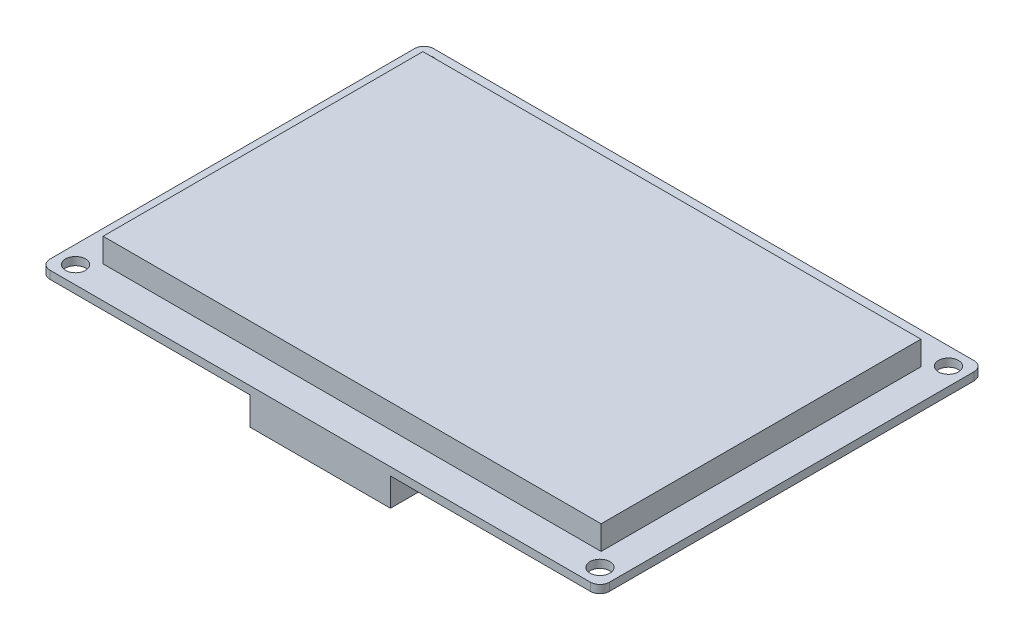
ISO-10303-21;
HEADER;
FILE_DESCRIPTION(('STEP AP214'),'2;1');
FILE_NAME('part.step','',(''),(''),'','','');
FILE_SCHEMA(('AUTOMOTIVE_DESIGN { 1 0 10303 214 1 1 1 1 }'));
ENDSEC;
DATA;
#1=APPLICATION_CONTEXT('core data for automotive mechanical design processes');
#2=APPLICATION_PROTOCOL_DEFINITION('international standard','automotive_design',2000,#1);
#3=PRODUCT_CONTEXT('',#1,'mechanical');
#4=PRODUCT('Part','Part','',(#3));
#5=PRODUCT_RELATED_PRODUCT_CATEGORY('part','',(#4));
#6=PRODUCT_DEFINITION_FORMATION('','',#4);
#7=PRODUCT_DEFINITION_CONTEXT('part definition',#1,'design');
#8=PRODUCT_DEFINITION('design','',#6,#7);
#9=PRODUCT_DEFINITION_SHAPE('','',#8);
#10=(LENGTH_UNIT() NAMED_UNIT(*) SI_UNIT(.MILLI.,.METRE.));
#11=(NAMED_UNIT(*) PLANE_ANGLE_UNIT() SI_UNIT($,.RADIAN.));
#12=(NAMED_UNIT(*) SI_UNIT($,.STERADIAN.) SOLID_ANGLE_UNIT());
#13=UNCERTAINTY_MEASURE_WITH_UNIT(LENGTH_MEASURE(1.E-05),#10,'distance_accuracy_value','');
#14=(GEOMETRIC_REPRESENTATION_CONTEXT(3) GLOBAL_UNCERTAINTY_ASSIGNED_CONTEXT((#13)) GLOBAL_UNIT_ASSIGNED_CONTEXT((#10,
#11,#12)) REPRESENTATION_CONTEXT('',''));
#15=CARTESIAN_POINT('',(0.,0.,0.));
#16=DIRECTION('',(0.,0.,1.));
#17=DIRECTION('',(1.,0.,0.));
#18=AXIS2_PLACEMENT_3D('',#15,#16,#17);
#19=CARTESIAN_POINT('',(0.,1.,0.));
#20=DIRECTION('',(0.,-1.,0.));
#21=DIRECTION('',(0.,0.,-1.));
#22=AXIS2_PLACEMENT_3D('',#19,#20,#21);
#23=PLANE('',#22);
#24=CARTESIAN_POINT('',(32.8,1.,-21.8));
#25=DIRECTION('',(0.,1.,0.));
#26=DIRECTION('',(0.,0.,-1.));
#27=AXIS2_PLACEMENT_3D('',#24,#25,#26);
#28=CIRCLE('',#27,1.25);
#29=CARTESIAN_POINT('',(32.8,1.,-23.05));
#30=VERTEX_POINT('',#29);
#31=EDGE_CURVE('E218',#30,#30,#28,.T.);
#32=ORIENTED_EDGE('',*,*,#31,.F.);
#33=EDGE_LOOP('',(#32));
#34=FACE_BOUND('',#33,.T.);
#35=CARTESIAN_POINT('',(32.8,1.,21.8));
#36=DIRECTION('',(0.,1.,0.));
#37=DIRECTION('',(0.,0.,1.));
#38=AXIS2_PLACEMENT_3D('',#35,#36,#37);
#39=CIRCLE('',#38,1.25);
#40=CARTESIAN_POINT('',(32.8,1.,23.05));
#41=VERTEX_POINT('',#40);
#42=EDGE_CURVE('E224',#41,#41,#39,.T.);
#43=ORIENTED_EDGE('',*,*,#42,.F.);
#44=EDGE_LOOP('',(#43));
#45=FACE_BOUND('',#44,.T.);
#46=CARTESIAN_POINT('',(-32.8,1.,21.8));
#47=DIRECTION('',(0.,1.,0.));
#48=DIRECTION('',(0.,0.,-1.));
#49=AXIS2_PLACEMENT_3D('',#46,#47,#48);
#50=CIRCLE('',#49,1.25);
#51=CARTESIAN_POINT('',(-32.8,1.,20.55));
#52=VERTEX_POINT('',#51);
#53=EDGE_CURVE('E230',#52,#52,#50,.T.);
#54=ORIENTED_EDGE('',*,*,#53,.F.);
#55=EDGE_LOOP('',(#54));
#56=FACE_BOUND('',#55,.T.);
#57=CARTESIAN_POINT('',(-32.8,1.,-21.8));
#58=DIRECTION('',(0.,1.,0.));
#59=DIRECTION('',(0.,0.,1.));
#60=AXIS2_PLACEMENT_3D('',#57,#58,#59);
#61=CIRCLE('',#60,1.25);
#62=CARTESIAN_POINT('',(-32.8,1.,-20.55));
#63=VERTEX_POINT('',#62);
#64=EDGE_CURVE('E236',#63,#63,#61,.T.);
#65=ORIENTED_EDGE('',*,*,#64,.F.);
#66=EDGE_LOOP('',(#65));
#67=FACE_BOUND('',#66,.T.);
#68=DIRECTION('',(0.,0.,1.));
#69=VECTOR('',#68,1.);
#70=CARTESIAN_POINT('',(-35.,1.,24.));
#71=LINE('',#70,#69);
#72=CARTESIAN_POINT('',(-35.,1.,-22.8));
#73=VERTEX_POINT('',#72);
#74=CARTESIAN_POINT('',(-35.,1.,22.8));
#75=VERTEX_POINT('',#74);
#76=EDGE_CURVE('E247',#73,#75,#71,.T.);
#77=ORIENTED_EDGE('',*,*,#76,.T.);
#78=CARTESIAN_POINT('',(-33.8,1.,22.8));
#79=DIRECTION('',(0.,-1.,0.));
#80=DIRECTION('',(0.,0.,-1.));
#81=AXIS2_PLACEMENT_3D('',#78,#79,#80);
#82=CIRCLE('',#81,1.2);
#83=CARTESIAN_POINT('',(-33.8,1.,24.));
#84=VERTEX_POINT('',#83);
#85=EDGE_CURVE('E285',#75,#84,#82,.F.);
#86=ORIENTED_EDGE('',*,*,#85,.T.);
#87=DIRECTION('',(1.,0.,0.));
#88=VECTOR('',#87,1.);
#89=CARTESIAN_POINT('',(-35.,1.,24.));
#90=LINE('',#89,#88);
#91=CARTESIAN_POINT('',(33.8,1.,24.));
#92=VERTEX_POINT('',#91);
#93=EDGE_CURVE('E250',#84,#92,#90,.T.);
#94=ORIENTED_EDGE('',*,*,#93,.T.);
#95=CARTESIAN_POINT('',(33.8,1.,22.8));
#96=DIRECTION('',(0.,-1.,0.));
#97=DIRECTION('',(0.,0.,-1.));
#98=AXIS2_PLACEMENT_3D('',#95,#96,#97);
#99=CIRCLE('',#98,1.2);
#100=CARTESIAN_POINT('',(35.,1.,22.8));
#101=VERTEX_POINT('',#100);
#102=EDGE_CURVE('E280',#92,#101,#99,.F.);
#103=ORIENTED_EDGE('',*,*,#102,.T.);
#104=DIRECTION('',(0.,0.,-1.));
#105=VECTOR('',#104,1.);
#106=CARTESIAN_POINT('',(35.,1.,24.));
#107=LINE('',#106,#105);
#108=CARTESIAN_POINT('',(35.,1.,-22.8));
#109=VERTEX_POINT('',#108);
#110=EDGE_CURVE('E242',#101,#109,#107,.T.);
#111=ORIENTED_EDGE('',*,*,#110,.T.);
#112=CARTESIAN_POINT('',(33.8,1.,-22.8));
#113=DIRECTION('',(0.,-1.,0.));
#114=DIRECTION('',(0.,0.,-1.));
#115=AXIS2_PLACEMENT_3D('',#112,#113,#114);
#116=CIRCLE('',#115,1.2);
#117=CARTESIAN_POINT('',(33.8,1.,-24.));
#118=VERTEX_POINT('',#117);
#119=EDGE_CURVE('E61',#109,#118,#116,.F.);
#120=ORIENTED_EDGE('',*,*,#119,.T.);
#121=DIRECTION('',(-1.,0.,0.));
#122=VECTOR('',#121,1.);
#123=CARTESIAN_POINT('',(-35.,1.,-24.));
#124=LINE('',#123,#122);
#125=CARTESIAN_POINT('',(-33.8,1.,-24.));
#126=VERTEX_POINT('',#125);
#127=EDGE_CURVE('E244',#118,#126,#124,.T.);
#128=ORIENTED_EDGE('',*,*,#127,.T.);
#129=CARTESIAN_POINT('',(-33.8,1.,-22.8));
#130=DIRECTION('',(0.,-1.,0.));
#131=DIRECTION('',(0.,0.,-1.));
#132=AXIS2_PLACEMENT_3D('',#129,#130,#131);
#133=CIRCLE('',#132,1.2);
#134=EDGE_CURVE('E283',#126,#73,#133,.F.);
#135=ORIENTED_EDGE('',*,*,#134,.T.);
#136=EDGE_LOOP('',(#77,#86,#94,#103,#111,#120,#128,#135));
#137=FACE_BOUND('',#136,.T.);
#138=DIRECTION('',(0.,0.,-1.));
#139=VECTOR('',#138,1.);
#140=CARTESIAN_POINT('',(31.15,1.,20.));
#141=LINE('',#140,#139);
#142=CARTESIAN_POINT('',(31.15,1.,20.));
#143=VERTEX_POINT('',#142);
#144=CARTESIAN_POINT('',(31.15,1.,-20.));
#145=VERTEX_POINT('',#144);
#146=EDGE_CURVE('E179',#143,#145,#141,.T.);
#147=ORIENTED_EDGE('',*,*,#146,.F.);
#148=DIRECTION('',(1.,0.,0.));
#149=VECTOR('',#148,1.);
#150=CARTESIAN_POINT('',(-31.15,1.,20.));
#151=LINE('',#150,#149);
#152=CARTESIAN_POINT('',(-31.15,1.,20.));
#153=VERTEX_POINT('',#152);
#154=EDGE_CURVE('E192',#153,#143,#151,.T.);
#155=ORIENTED_EDGE('',*,*,#154,.F.);
#156=DIRECTION('',(0.,0.,1.));
#157=VECTOR('',#156,1.);
#158=CARTESIAN_POINT('',(-31.15,1.,20.));
#159=LINE('',#158,#157);
#160=CARTESIAN_POINT('',(-31.15,1.,-20.));
#161=VERTEX_POINT('',#160);
#162=EDGE_CURVE('E201',#161,#153,#159,.T.);
#163=ORIENTED_EDGE('',*,*,#162,.F.);
#164=DIRECTION('',(-1.,0.,0.));
#165=VECTOR('',#164,1.);
#166=CARTESIAN_POINT('',(-31.15,1.,-20.));
#167=LINE('',#166,#165);
#168=EDGE_CURVE('E182',#145,#161,#167,.T.);
#169=ORIENTED_EDGE('',*,*,#168,.F.);
#170=EDGE_LOOP('',(#147,#155,#163,#169));
#171=FACE_BOUND('',#170,.T.);
#172=ADVANCED_FACE('F39',(#34,#45,#56,#67,#137,#171),#23,.F.);
#173=CARTESIAN_POINT('',(0.,0.,0.));
#174=DIRECTION('',(0.,-1.,0.));
#175=DIRECTION('',(0.,0.,-1.));
#176=AXIS2_PLACEMENT_3D('',#173,#174,#175);
#177=PLANE('',#176);
#178=DIRECTION('',(1.,0.,0.));
#179=VECTOR('',#178,1.);
#180=CARTESIAN_POINT('',(-35.,0.,24.));
#181=LINE('',#180,#179);
#182=CARTESIAN_POINT('',(-33.8,0.,24.));
#183=VERTEX_POINT('',#182);
#184=CARTESIAN_POINT('',(-8.80000000000001,0.,24.));
#185=VERTEX_POINT('',#184);
#186=EDGE_CURVE('E245',#183,#185,#181,.T.);
#187=ORIENTED_EDGE('',*,*,#186,.F.);
#188=CARTESIAN_POINT('',(-33.8,0.,22.8));
#189=DIRECTION('',(0.,-1.,0.));
#190=DIRECTION('',(0.,0.,-1.));
#191=AXIS2_PLACEMENT_3D('',#188,#189,#190);
#192=CIRCLE('',#191,1.2);
#193=CARTESIAN_POINT('',(-35.,0.,22.8));
#194=VERTEX_POINT('',#193);
#195=EDGE_CURVE('E273',#183,#194,#192,.T.);
#196=ORIENTED_EDGE('',*,*,#195,.T.);
#197=DIRECTION('',(0.,0.,1.));
#198=VECTOR('',#197,1.);
#199=CARTESIAN_POINT('',(-35.,0.,24.));
#200=LINE('',#199,#198);
#201=CARTESIAN_POINT('',(-35.,0.,-22.8));
#202=VERTEX_POINT('',#201);
#203=EDGE_CURVE('E258',#202,#194,#200,.T.);
#204=ORIENTED_EDGE('',*,*,#203,.F.);
#205=CARTESIAN_POINT('',(-33.8,0.,-22.8));
#206=DIRECTION('',(0.,-1.,0.));
#207=DIRECTION('',(0.,0.,-1.));
#208=AXIS2_PLACEMENT_3D('',#205,#206,#207);
#209=CIRCLE('',#208,1.2);
#210=CARTESIAN_POINT('',(-33.8,0.,-24.));
#211=VERTEX_POINT('',#210);
#212=EDGE_CURVE('E271',#202,#211,#209,.T.);
#213=ORIENTED_EDGE('',*,*,#212,.T.);
#214=DIRECTION('',(-1.,0.,0.));
#215=VECTOR('',#214,1.);
#216=CARTESIAN_POINT('',(-35.,0.,-24.));
#217=LINE('',#216,#215);
#218=CARTESIAN_POINT('',(33.8,0.,-24.));
#219=VERTEX_POINT('',#218);
#220=EDGE_CURVE('E256',#219,#211,#217,.T.);
#221=ORIENTED_EDGE('',*,*,#220,.F.);
#222=CARTESIAN_POINT('',(33.8,0.,-22.8));
#223=DIRECTION('',(0.,-1.,0.));
#224=DIRECTION('',(0.,0.,-1.));
#225=AXIS2_PLACEMENT_3D('',#222,#223,#224);
#226=CIRCLE('',#225,1.2);
#227=CARTESIAN_POINT('',(35.,0.,-22.8));
#228=VERTEX_POINT('',#227);
#229=EDGE_CURVE('E269',#219,#228,#226,.T.);
#230=ORIENTED_EDGE('',*,*,#229,.T.);
#231=DIRECTION('',(0.,0.,-1.));
#232=VECTOR('',#231,1.);
#233=CARTESIAN_POINT('',(35.,0.,24.));
#234=LINE('',#233,#232);
#235=CARTESIAN_POINT('',(35.,0.,22.8));
#236=VERTEX_POINT('',#235);
#237=EDGE_CURVE('E239',#236,#228,#234,.T.);
#238=ORIENTED_EDGE('',*,*,#237,.F.);
#239=CARTESIAN_POINT('',(33.8,0.,22.8));
#240=DIRECTION('',(0.,-1.,0.));
#241=DIRECTION('',(0.,0.,-1.));
#242=AXIS2_PLACEMENT_3D('',#239,#240,#241);
#243=CIRCLE('',#242,1.2);
#244=CARTESIAN_POINT('',(33.8,0.,24.));
#245=VERTEX_POINT('',#244);
#246=EDGE_CURVE('E267',#236,#245,#243,.T.);
#247=ORIENTED_EDGE('',*,*,#246,.T.);
#248=CARTESIAN_POINT('',(8.8,0.,24.));
#249=VERTEX_POINT('',#248);
#250=EDGE_CURVE('E261',#249,#245,#181,.T.);
#251=ORIENTED_EDGE('',*,*,#250,.F.);
#252=DIRECTION('',(0.,0.,1.));
#253=VECTOR('',#252,1.);
#254=CARTESIAN_POINT('',(8.8,0.,-7.));
#255=LINE('',#254,#253);
#256=CARTESIAN_POINT('',(8.8,0.,-7.));
#257=VERTEX_POINT('',#256);
#258=EDGE_CURVE('E178',#257,#249,#255,.T.);
#259=ORIENTED_EDGE('',*,*,#258,.F.);
#260=DIRECTION('',(1.,0.,0.));
#261=VECTOR('',#260,1.);
#262=CARTESIAN_POINT('',(-8.8,0.,-7.));
#263=LINE('',#262,#261);
#264=CARTESIAN_POINT('',(-8.8,0.,-7.));
#265=VERTEX_POINT('',#264);
#266=EDGE_CURVE('E175',#265,#257,#263,.T.);
#267=ORIENTED_EDGE('',*,*,#266,.F.);
#268=DIRECTION('',(0.,0.,-1.));
#269=VECTOR('',#268,1.);
#270=CARTESIAN_POINT('',(-8.8,0.,-7.));
#271=LINE('',#270,#269);
#272=EDGE_CURVE('E559',#185,#265,#271,.T.);
#273=ORIENTED_EDGE('',*,*,#272,.F.);
#274=EDGE_LOOP('',(#187,#196,#204,#213,#221,#230,#238,#247,#251,#259,#267,#273));
#275=FACE_BOUND('',#274,.T.);
#276=CARTESIAN_POINT('',(32.8,0.,21.8));
#277=DIRECTION('',(0.,1.,0.));
#278=DIRECTION('',(0.,0.,1.));
#279=AXIS2_PLACEMENT_3D('',#276,#277,#278);
#280=CIRCLE('',#279,1.25);
#281=CARTESIAN_POINT('',(32.8,0.,23.05));
#282=VERTEX_POINT('',#281);
#283=EDGE_CURVE('E221',#282,#282,#280,.T.);
#284=ORIENTED_EDGE('',*,*,#283,.T.);
#285=EDGE_LOOP('',(#284));
#286=FACE_BOUND('',#285,.T.);
#287=CARTESIAN_POINT('',(-32.8,0.,-21.8));
#288=DIRECTION('',(0.,1.,0.));
#289=DIRECTION('',(0.,0.,1.));
#290=AXIS2_PLACEMENT_3D('',#287,#288,#289);
#291=CIRCLE('',#290,1.25);
#292=CARTESIAN_POINT('',(-32.8,0.,-20.55));
#293=VERTEX_POINT('',#292);
#294=EDGE_CURVE('E233',#293,#293,#291,.T.);
#295=ORIENTED_EDGE('',*,*,#294,.T.);
#296=EDGE_LOOP('',(#295));
#297=FACE_BOUND('',#296,.T.);
#298=CARTESIAN_POINT('',(-32.8,0.,21.8));
#299=DIRECTION('',(0.,1.,0.));
#300=DIRECTION('',(0.,0.,-1.));
#301=AXIS2_PLACEMENT_3D('',#298,#299,#300);
#302=CIRCLE('',#301,1.25);
#303=CARTESIAN_POINT('',(-32.8,0.,20.55));
#304=VERTEX_POINT('',#303);
#305=EDGE_CURVE('E227',#304,#304,#302,.T.);
#306=ORIENTED_EDGE('',*,*,#305,.T.);
#307=EDGE_LOOP('',(#306));
#308=FACE_BOUND('',#307,.T.);
#309=CARTESIAN_POINT('',(32.8,0.,-21.8));
#310=DIRECTION('',(0.,1.,0.));
#311=DIRECTION('',(0.,0.,-1.));
#312=AXIS2_PLACEMENT_3D('',#309,#310,#311);
#313=CIRCLE('',#312,1.25);
#314=CARTESIAN_POINT('',(32.8,0.,-23.05));
#315=VERTEX_POINT('',#314);
#316=EDGE_CURVE('E217',#315,#315,#313,.T.);
#317=ORIENTED_EDGE('',*,*,#316,.T.);
#318=EDGE_LOOP('',(#317));
#319=FACE_BOUND('',#318,.T.);
#320=ADVANCED_FACE('F301',(#275,#286,#297,#308,#319),#177,.T.);
#321=CARTESIAN_POINT('',(35.,1.,24.));
#322=DIRECTION('',(-1.,0.,0.));
#323=DIRECTION('',(0.,0.,1.));
#324=AXIS2_PLACEMENT_3D('',#321,#322,#323);
#325=PLANE('',#324);
#326=ORIENTED_EDGE('',*,*,#237,.T.);
#327=DIRECTION('',(0.,-1.,0.));
#328=VECTOR('',#327,1.);
#329=CARTESIAN_POINT('',(35.,1.,-22.8));
#330=LINE('',#329,#328);
#331=EDGE_CURVE('E11',#228,#109,#330,.F.);
#332=ORIENTED_EDGE('',*,*,#331,.T.);
#333=ORIENTED_EDGE('',*,*,#110,.F.);
#334=DIRECTION('',(0.,-1.,0.));
#335=VECTOR('',#334,1.);
#336=CARTESIAN_POINT('',(35.,1.,22.8));
#337=LINE('',#336,#335);
#338=EDGE_CURVE('E47',#101,#236,#337,.T.);
#339=ORIENTED_EDGE('',*,*,#338,.T.);
#340=EDGE_LOOP('',(#326,#332,#333,#339));
#341=FACE_BOUND('',#340,.T.);
#342=ADVANCED_FACE('F295',(#341),#325,.F.);
#343=CARTESIAN_POINT('',(-35.,1.,-24.));
#344=DIRECTION('',(0.,0.,1.));
#345=DIRECTION('',(1.,0.,0.));
#346=AXIS2_PLACEMENT_3D('',#343,#344,#345);
#347=PLANE('',#346);
#348=ORIENTED_EDGE('',*,*,#220,.T.);
#349=DIRECTION('',(0.,-1.,0.));
#350=VECTOR('',#349,1.);
#351=CARTESIAN_POINT('',(-33.8,1.,-24.));
#352=LINE('',#351,#350);
#353=EDGE_CURVE('E54',#211,#126,#352,.F.);
#354=ORIENTED_EDGE('',*,*,#353,.T.);
#355=ORIENTED_EDGE('',*,*,#127,.F.);
#356=DIRECTION('',(0.,-1.,0.));
#357=VECTOR('',#356,1.);
#358=CARTESIAN_POINT('',(33.8,1.,-24.));
#359=LINE('',#358,#357);
#360=EDGE_CURVE('E287',#118,#219,#359,.T.);
#361=ORIENTED_EDGE('',*,*,#360,.T.);
#362=EDGE_LOOP('',(#348,#354,#355,#361));
#363=FACE_BOUND('',#362,.T.);
#364=ADVANCED_FACE('F307',(#363),#347,.F.);
#365=CARTESIAN_POINT('',(-35.,1.,24.));
#366=DIRECTION('',(1.,0.,0.));
#367=DIRECTION('',(0.,0.,-1.));
#368=AXIS2_PLACEMENT_3D('',#365,#366,#367);
#369=PLANE('',#368);
#370=ORIENTED_EDGE('',*,*,#203,.T.);
#371=DIRECTION('',(0.,-1.,0.));
#372=VECTOR('',#371,1.);
#373=CARTESIAN_POINT('',(-35.,1.,22.8));
#374=LINE('',#373,#372);
#375=EDGE_CURVE('E278',#194,#75,#374,.F.);
#376=ORIENTED_EDGE('',*,*,#375,.T.);
#377=ORIENTED_EDGE('',*,*,#76,.F.);
#378=DIRECTION('',(0.,-1.,0.));
#379=VECTOR('',#378,1.);
#380=CARTESIAN_POINT('',(-35.,1.,-22.8));
#381=LINE('',#380,#379);
#382=EDGE_CURVE('E275',#73,#202,#381,.T.);
#383=ORIENTED_EDGE('',*,*,#382,.T.);
#384=EDGE_LOOP('',(#370,#376,#377,#383));
#385=FACE_BOUND('',#384,.T.);
#386=ADVANCED_FACE('F316',(#385),#369,.F.);
#387=CARTESIAN_POINT('',(-35.,1.,24.));
#388=DIRECTION('',(0.,0.,-1.));
#389=DIRECTION('',(-1.,0.,0.));
#390=AXIS2_PLACEMENT_3D('',#387,#388,#389);
#391=PLANE('',#390);
#392=ORIENTED_EDGE('',*,*,#93,.F.);
#393=DIRECTION('',(0.,-1.,0.));
#394=VECTOR('',#393,1.);
#395=CARTESIAN_POINT('',(-33.8,1.,24.));
#396=LINE('',#395,#394);
#397=EDGE_CURVE('E264',#84,#183,#396,.T.);
#398=ORIENTED_EDGE('',*,*,#397,.T.);
#399=ORIENTED_EDGE('',*,*,#186,.T.);
#400=DIRECTION('',(0.,1.,0.));
#401=VECTOR('',#400,1.);
#402=CARTESIAN_POINT('',(-8.80000000000001,-3.5,24.));
#403=LINE('',#402,#401);
#404=CARTESIAN_POINT('',(-8.80000000000001,-3.5,24.));
#405=VERTEX_POINT('',#404);
#406=EDGE_CURVE('E162',#405,#185,#403,.T.);
#407=ORIENTED_EDGE('',*,*,#406,.F.);
#408=DIRECTION('',(-1.,0.,0.));
#409=VECTOR('',#408,1.);
#410=CARTESIAN_POINT('',(-8.80000000000001,-3.5,24.));
#411=LINE('',#410,#409);
#412=CARTESIAN_POINT('',(8.8,-3.5,24.));
#413=VERTEX_POINT('',#412);
#414=EDGE_CURVE('E153',#413,#405,#411,.T.);
#415=ORIENTED_EDGE('',*,*,#414,.F.);
#416=DIRECTION('',(0.,1.,0.));
#417=VECTOR('',#416,1.);
#418=CARTESIAN_POINT('',(8.8,-3.5,24.));
#419=LINE('',#418,#417);
#420=EDGE_CURVE('E159',#413,#249,#419,.T.);
#421=ORIENTED_EDGE('',*,*,#420,.T.);
#422=ORIENTED_EDGE('',*,*,#250,.T.);
#423=DIRECTION('',(0.,-1.,0.));
#424=VECTOR('',#423,1.);
#425=CARTESIAN_POINT('',(33.8,1.,24.));
#426=LINE('',#425,#424);
#427=EDGE_CURVE('E253',#245,#92,#426,.F.);
#428=ORIENTED_EDGE('',*,*,#427,.T.);
#429=EDGE_LOOP('',(#392,#398,#399,#407,#415,#421,#422,#428));
#430=FACE_BOUND('',#429,.T.);
#431=ADVANCED_FACE('F156',(#430),#391,.F.);
#432=CARTESIAN_POINT('',(-32.8,1.,-21.8));
#433=DIRECTION('',(0.,-1.,0.));
#434=DIRECTION('',(0.,0.,-1.));
#435=AXIS2_PLACEMENT_3D('',#432,#433,#434);
#436=CYLINDRICAL_SURFACE('',#435,1.25);
#437=ORIENTED_EDGE('',*,*,#64,.T.);
#438=EDGE_LOOP('',(#437));
#439=FACE_BOUND('',#438,.T.);
#440=ORIENTED_EDGE('',*,*,#294,.F.);
#441=EDGE_LOOP('',(#440));
#442=FACE_BOUND('',#441,.T.);
#443=ADVANCED_FACE('F339',(#439,#442),#436,.F.);
#444=CARTESIAN_POINT('',(-32.8,1.,21.8));
#445=DIRECTION('',(0.,-1.,0.));
#446=DIRECTION('',(0.,0.,-1.));
#447=AXIS2_PLACEMENT_3D('',#444,#445,#446);
#448=CYLINDRICAL_SURFACE('',#447,1.25);
#449=ORIENTED_EDGE('',*,*,#53,.T.);
#450=EDGE_LOOP('',(#449));
#451=FACE_BOUND('',#450,.T.);
#452=ORIENTED_EDGE('',*,*,#305,.F.);
#453=EDGE_LOOP('',(#452));
#454=FACE_BOUND('',#453,.T.);
#455=ADVANCED_FACE('F471',(#451,#454),#448,.F.);
#456=CARTESIAN_POINT('',(32.8,1.,21.8));
#457=DIRECTION('',(0.,-1.,0.));
#458=DIRECTION('',(0.,0.,-1.));
#459=AXIS2_PLACEMENT_3D('',#456,#457,#458);
#460=CYLINDRICAL_SURFACE('',#459,1.25);
#461=ORIENTED_EDGE('',*,*,#42,.T.);
#462=EDGE_LOOP('',(#461));
#463=FACE_BOUND('',#462,.T.);
#464=ORIENTED_EDGE('',*,*,#283,.F.);
#465=EDGE_LOOP('',(#464));
#466=FACE_BOUND('',#465,.T.);
#467=ADVANCED_FACE('F462',(#463,#466),#460,.F.);
#468=CARTESIAN_POINT('',(32.8,1.,-21.8));
#469=DIRECTION('',(0.,-1.,0.));
#470=DIRECTION('',(0.,0.,-1.));
#471=AXIS2_PLACEMENT_3D('',#468,#469,#470);
#472=CYLINDRICAL_SURFACE('',#471,1.25);
#473=ORIENTED_EDGE('',*,*,#31,.T.);
#474=EDGE_LOOP('',(#473));
#475=FACE_BOUND('',#474,.T.);
#476=ORIENTED_EDGE('',*,*,#316,.F.);
#477=EDGE_LOOP('',(#476));
#478=FACE_BOUND('',#477,.T.);
#479=ADVANCED_FACE('F448',(#475,#478),#472,.F.);
#480=CARTESIAN_POINT('',(31.15,4.,20.));
#481=DIRECTION('',(-1.,0.,0.));
#482=DIRECTION('',(0.,0.,1.));
#483=AXIS2_PLACEMENT_3D('',#480,#481,#482);
#484=PLANE('',#483);
#485=ORIENTED_EDGE('',*,*,#146,.T.);
#486=DIRECTION('',(0.,-1.,0.));
#487=VECTOR('',#486,1.);
#488=CARTESIAN_POINT('',(31.15,4.,-20.));
#489=LINE('',#488,#487);
#490=CARTESIAN_POINT('',(31.15,4.,-20.));
#491=VERTEX_POINT('',#490);
#492=EDGE_CURVE('E214',#491,#145,#489,.T.);
#493=ORIENTED_EDGE('',*,*,#492,.F.);
#494=DIRECTION('',(0.,0.,-1.));
#495=VECTOR('',#494,1.);
#496=CARTESIAN_POINT('',(31.15,4.,20.));
#497=LINE('',#496,#495);
#498=CARTESIAN_POINT('',(31.15,4.,20.));
#499=VERTEX_POINT('',#498);
#500=EDGE_CURVE('E188',#499,#491,#497,.T.);
#501=ORIENTED_EDGE('',*,*,#500,.F.);
#502=DIRECTION('',(0.,-1.,0.));
#503=VECTOR('',#502,1.);
#504=CARTESIAN_POINT('',(31.15,4.,20.));
#505=LINE('',#504,#503);
#506=EDGE_CURVE('E197',#499,#143,#505,.T.);
#507=ORIENTED_EDGE('',*,*,#506,.T.);
#508=EDGE_LOOP('',(#485,#493,#501,#507));
#509=FACE_BOUND('',#508,.T.);
#510=ADVANCED_FACE('F440',(#509),#484,.F.);
#511=CARTESIAN_POINT('',(-31.15,4.,-20.));
#512=DIRECTION('',(0.,0.,1.));
#513=DIRECTION('',(1.,0.,0.));
#514=AXIS2_PLACEMENT_3D('',#511,#512,#513);
#515=PLANE('',#514);
#516=ORIENTED_EDGE('',*,*,#168,.T.);
#517=DIRECTION('',(0.,-1.,0.));
#518=VECTOR('',#517,1.);
#519=CARTESIAN_POINT('',(-31.15,4.,-20.));
#520=LINE('',#519,#518);
#521=CARTESIAN_POINT('',(-31.15,4.,-20.));
#522=VERTEX_POINT('',#521);
#523=EDGE_CURVE('E211',#522,#161,#520,.T.);
#524=ORIENTED_EDGE('',*,*,#523,.F.);
#525=DIRECTION('',(-1.,0.,0.));
#526=VECTOR('',#525,1.);
#527=CARTESIAN_POINT('',(-31.15,4.,-20.));
#528=LINE('',#527,#526);
#529=EDGE_CURVE('E191',#491,#522,#528,.T.);
#530=ORIENTED_EDGE('',*,*,#529,.F.);
#531=ORIENTED_EDGE('',*,*,#492,.T.);
#532=EDGE_LOOP('',(#516,#524,#530,#531));
#533=FACE_BOUND('',#532,.T.);
#534=ADVANCED_FACE('F431',(#533),#515,.F.);
#535=CARTESIAN_POINT('',(-31.15,4.,20.));
#536=DIRECTION('',(1.,0.,0.));
#537=DIRECTION('',(0.,0.,-1.));
#538=AXIS2_PLACEMENT_3D('',#535,#536,#537);
#539=PLANE('',#538);
#540=ORIENTED_EDGE('',*,*,#162,.T.);
#541=DIRECTION('',(0.,-1.,0.));
#542=VECTOR('',#541,1.);
#543=CARTESIAN_POINT('',(-31.15,4.,20.));
#544=LINE('',#543,#542);
#545=CARTESIAN_POINT('',(-31.15,4.,20.));
#546=VERTEX_POINT('',#545);
#547=EDGE_CURVE('E208',#546,#153,#544,.T.);
#548=ORIENTED_EDGE('',*,*,#547,.F.);
#549=DIRECTION('',(0.,0.,1.));
#550=VECTOR('',#549,1.);
#551=CARTESIAN_POINT('',(-31.15,4.,20.));
#552=LINE('',#551,#550);
#553=EDGE_CURVE('E194',#522,#546,#552,.T.);
#554=ORIENTED_EDGE('',*,*,#553,.F.);
#555=ORIENTED_EDGE('',*,*,#523,.T.);
#556=EDGE_LOOP('',(#540,#548,#554,#555));
#557=FACE_BOUND('',#556,.T.);
#558=ADVANCED_FACE('F422',(#557),#539,.F.);
#559=CARTESIAN_POINT('',(-31.15,4.,20.));
#560=DIRECTION('',(0.,0.,-1.));
#561=DIRECTION('',(-1.,0.,0.));
#562=AXIS2_PLACEMENT_3D('',#559,#560,#561);
#563=PLANE('',#562);
#564=ORIENTED_EDGE('',*,*,#154,.T.);
#565=ORIENTED_EDGE('',*,*,#506,.F.);
#566=DIRECTION('',(1.,0.,0.));
#567=VECTOR('',#566,1.);
#568=CARTESIAN_POINT('',(-31.15,4.,20.));
#569=LINE('',#568,#567);
#570=EDGE_CURVE('E196',#546,#499,#569,.T.);
#571=ORIENTED_EDGE('',*,*,#570,.F.);
#572=ORIENTED_EDGE('',*,*,#547,.T.);
#573=EDGE_LOOP('',(#564,#565,#571,#572));
#574=FACE_BOUND('',#573,.T.);
#575=ADVANCED_FACE('F413',(#574),#563,.F.);
#576=CARTESIAN_POINT('',(0.,4.,0.));
#577=DIRECTION('',(0.,-1.,0.));
#578=DIRECTION('',(0.,0.,-1.));
#579=AXIS2_PLACEMENT_3D('',#576,#577,#578);
#580=PLANE('',#579);
#581=ORIENTED_EDGE('',*,*,#500,.T.);
#582=ORIENTED_EDGE('',*,*,#529,.T.);
#583=ORIENTED_EDGE('',*,*,#553,.T.);
#584=ORIENTED_EDGE('',*,*,#570,.T.);
#585=EDGE_LOOP('',(#581,#582,#583,#584));
#586=FACE_BOUND('',#585,.T.);
#587=ADVANCED_FACE('F404',(#586),#580,.F.);
#588=CARTESIAN_POINT('',(8.8,-3.5,-7.));
#589=DIRECTION('',(-1.,0.,0.));
#590=DIRECTION('',(0.,0.,1.));
#591=AXIS2_PLACEMENT_3D('',#588,#589,#590);
#592=PLANE('',#591);
#593=ORIENTED_EDGE('',*,*,#258,.T.);
#594=ORIENTED_EDGE('',*,*,#420,.F.);
#595=DIRECTION('',(0.,0.,1.));
#596=VECTOR('',#595,1.);
#597=CARTESIAN_POINT('',(8.8,-3.5,-7.));
#598=LINE('',#597,#596);
#599=CARTESIAN_POINT('',(8.8,-3.5,-7.));
#600=VERTEX_POINT('',#599);
#601=EDGE_CURVE('E166',#600,#413,#598,.T.);
#602=ORIENTED_EDGE('',*,*,#601,.F.);
#603=DIRECTION('',(0.,1.,0.));
#604=VECTOR('',#603,1.);
#605=CARTESIAN_POINT('',(8.8,-3.5,-7.));
#606=LINE('',#605,#604);
#607=EDGE_CURVE('E563',#600,#257,#606,.T.);
#608=ORIENTED_EDGE('',*,*,#607,.T.);
#609=EDGE_LOOP('',(#593,#594,#602,#608));
#610=FACE_BOUND('',#609,.T.);
#611=ADVANCED_FACE('F177',(#610),#592,.F.);
#612=CARTESIAN_POINT('',(-8.8,-3.5,-7.));
#613=DIRECTION('',(1.,0.,0.));
#614=DIRECTION('',(0.,0.,-1.));
#615=AXIS2_PLACEMENT_3D('',#612,#613,#614);
#616=PLANE('',#615);
#617=ORIENTED_EDGE('',*,*,#272,.T.);
#618=DIRECTION('',(0.,1.,0.));
#619=VECTOR('',#618,1.);
#620=CARTESIAN_POINT('',(-8.8,-3.5,-7.));
#621=LINE('',#620,#619);
#622=CARTESIAN_POINT('',(-8.8,-3.5,-7.));
#623=VERTEX_POINT('',#622);
#624=EDGE_CURVE('E184',#623,#265,#621,.T.);
#625=ORIENTED_EDGE('',*,*,#624,.F.);
#626=DIRECTION('',(0.,0.,-1.));
#627=VECTOR('',#626,1.);
#628=CARTESIAN_POINT('',(-8.8,-3.5,-7.));
#629=LINE('',#628,#627);
#630=EDGE_CURVE('E165',#405,#623,#629,.T.);
#631=ORIENTED_EDGE('',*,*,#630,.F.);
#632=ORIENTED_EDGE('',*,*,#406,.T.);
#633=EDGE_LOOP('',(#617,#625,#631,#632));
#634=FACE_BOUND('',#633,.T.);
#635=ADVANCED_FACE('F387',(#634),#616,.F.);
#636=CARTESIAN_POINT('',(-8.8,-3.5,-7.));
#637=DIRECTION('',(0.,0.,1.));
#638=DIRECTION('',(1.,0.,0.));
#639=AXIS2_PLACEMENT_3D('',#636,#637,#638);
#640=PLANE('',#639);
#641=ORIENTED_EDGE('',*,*,#266,.T.);
#642=ORIENTED_EDGE('',*,*,#607,.F.);
#643=DIRECTION('',(1.,0.,0.));
#644=VECTOR('',#643,1.);
#645=CARTESIAN_POINT('',(-8.8,-3.5,-7.));
#646=LINE('',#645,#644);
#647=EDGE_CURVE('E171',#623,#600,#646,.T.);
#648=ORIENTED_EDGE('',*,*,#647,.F.);
#649=ORIENTED_EDGE('',*,*,#624,.T.);
#650=EDGE_LOOP('',(#641,#642,#648,#649));
#651=FACE_BOUND('',#650,.T.);
#652=ADVANCED_FACE('F379',(#651),#640,.F.);
#653=CARTESIAN_POINT('',(0.,-3.5,0.));
#654=DIRECTION('',(0.,1.,0.));
#655=DIRECTION('',(0.,0.,1.));
#656=AXIS2_PLACEMENT_3D('',#653,#654,#655);
#657=PLANE('',#656);
#658=ORIENTED_EDGE('',*,*,#601,.T.);
#659=ORIENTED_EDGE('',*,*,#414,.T.);
#660=ORIENTED_EDGE('',*,*,#630,.T.);
#661=ORIENTED_EDGE('',*,*,#647,.T.);
#662=EDGE_LOOP('',(#658,#659,#660,#661));
#663=FACE_BOUND('',#662,.T.);
#664=ADVANCED_FACE('F169',(#663),#657,.F.);
#665=CARTESIAN_POINT('',(-33.8,1.,22.8));
#666=DIRECTION('',(0.,-1.,0.));
#667=DIRECTION('',(0.,0.,-1.));
#668=AXIS2_PLACEMENT_3D('',#665,#666,#667);
#669=CYLINDRICAL_SURFACE('',#668,1.2);
#670=ORIENTED_EDGE('',*,*,#85,.F.);
#671=ORIENTED_EDGE('',*,*,#375,.F.);
#672=ORIENTED_EDGE('',*,*,#195,.F.);
#673=ORIENTED_EDGE('',*,*,#397,.F.);
#674=EDGE_LOOP('',(#670,#671,#672,#673));
#675=FACE_BOUND('',#674,.T.);
#676=ADVANCED_FACE('F322',(#675),#669,.T.);
#677=CARTESIAN_POINT('',(-33.8,1.,-22.8));
#678=DIRECTION('',(0.,-1.,0.));
#679=DIRECTION('',(0.,0.,-1.));
#680=AXIS2_PLACEMENT_3D('',#677,#678,#679);
#681=CYLINDRICAL_SURFACE('',#680,1.2);
#682=ORIENTED_EDGE('',*,*,#134,.F.);
#683=ORIENTED_EDGE('',*,*,#353,.F.);
#684=ORIENTED_EDGE('',*,*,#212,.F.);
#685=ORIENTED_EDGE('',*,*,#382,.F.);
#686=EDGE_LOOP('',(#682,#683,#684,#685));
#687=FACE_BOUND('',#686,.T.);
#688=ADVANCED_FACE('F313',(#687),#681,.T.);
#689=CARTESIAN_POINT('',(33.8,1.,-22.8));
#690=DIRECTION('',(0.,-1.,0.));
#691=DIRECTION('',(0.,0.,-1.));
#692=AXIS2_PLACEMENT_3D('',#689,#690,#691);
#693=CYLINDRICAL_SURFACE('',#692,1.2);
#694=ORIENTED_EDGE('',*,*,#119,.F.);
#695=ORIENTED_EDGE('',*,*,#331,.F.);
#696=ORIENTED_EDGE('',*,*,#229,.F.);
#697=ORIENTED_EDGE('',*,*,#360,.F.);
#698=EDGE_LOOP('',(#694,#695,#696,#697));
#699=FACE_BOUND('',#698,.T.);
#700=ADVANCED_FACE('F306',(#699),#693,.T.);
#701=CARTESIAN_POINT('',(33.8,1.,22.8));
#702=DIRECTION('',(0.,-1.,0.));
#703=DIRECTION('',(0.,0.,-1.));
#704=AXIS2_PLACEMENT_3D('',#701,#702,#703);
#705=CYLINDRICAL_SURFACE('',#704,1.2);
#706=ORIENTED_EDGE('',*,*,#102,.F.);
#707=ORIENTED_EDGE('',*,*,#427,.F.);
#708=ORIENTED_EDGE('',*,*,#246,.F.);
#709=ORIENTED_EDGE('',*,*,#338,.F.);
#710=EDGE_LOOP('',(#706,#707,#708,#709));
#711=FACE_BOUND('',#710,.T.);
#712=ADVANCED_FACE('F41',(#711),#705,.T.);
#713=CLOSED_SHELL('',(#172,#320,#342,#364,#386,#431,#443,#455,#467,#479,#510,#534,#558,#575,
#587,#611,#635,#652,#664,#676,#688,#700,#712));
#714=MANIFOLD_SOLID_BREP('B2',#713);
#715=ADVANCED_BREP_SHAPE_REPRESENTATION('',(#18,#714),#14);
#716=SHAPE_DEFINITION_REPRESENTATION(#9,#715);
ENDSEC;
END-ISO-10303-21;
